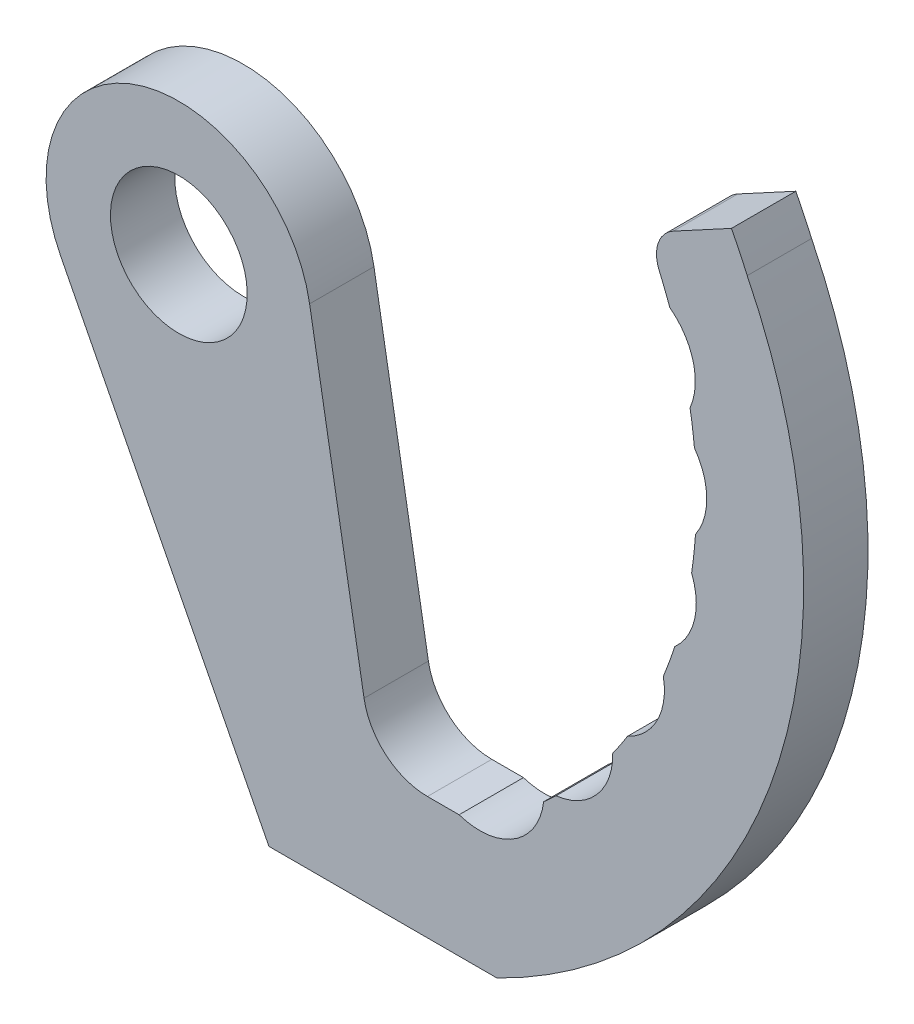
ISO-10303-21;
HEADER;
FILE_DESCRIPTION(('STEP AP214'),'2;1');
FILE_NAME('part.step','',(''),(''),'','','');
FILE_SCHEMA(('AUTOMOTIVE_DESIGN { 1 0 10303 214 1 1 1 1 }'));
ENDSEC;
DATA;
#1=APPLICATION_CONTEXT('core data for automotive mechanical design processes');
#2=APPLICATION_PROTOCOL_DEFINITION('international standard','automotive_design',2000,#1);
#3=PRODUCT_CONTEXT('',#1,'mechanical');
#4=PRODUCT('Part','Part','',(#3));
#5=PRODUCT_RELATED_PRODUCT_CATEGORY('part','',(#4));
#6=PRODUCT_DEFINITION_FORMATION('','',#4);
#7=PRODUCT_DEFINITION_CONTEXT('part definition',#1,'design');
#8=PRODUCT_DEFINITION('design','',#6,#7);
#9=PRODUCT_DEFINITION_SHAPE('','',#8);
#10=(LENGTH_UNIT() NAMED_UNIT(*) SI_UNIT(.MILLI.,.METRE.));
#11=(NAMED_UNIT(*) PLANE_ANGLE_UNIT() SI_UNIT($,.RADIAN.));
#12=(NAMED_UNIT(*) SI_UNIT($,.STERADIAN.) SOLID_ANGLE_UNIT());
#13=UNCERTAINTY_MEASURE_WITH_UNIT(LENGTH_MEASURE(1.E-05),#10,'distance_accuracy_value','');
#14=(GEOMETRIC_REPRESENTATION_CONTEXT(3) GLOBAL_UNCERTAINTY_ASSIGNED_CONTEXT((#13)) GLOBAL_UNIT_ASSIGNED_CONTEXT((#10,
#11,#12)) REPRESENTATION_CONTEXT('',''));
#15=CARTESIAN_POINT('',(0.,0.,0.));
#16=DIRECTION('',(0.,0.,1.));
#17=DIRECTION('',(1.,0.,0.));
#18=AXIS2_PLACEMENT_3D('',#15,#16,#17);
#19=CARTESIAN_POINT('',(24.7140074252524,-7.04904251244394,-32.9445393936819));
#20=DIRECTION('',(0.,0.,1.));
#21=DIRECTION('',(1.,0.,0.));
#22=AXIS2_PLACEMENT_3D('',#19,#20,#21);
#23=CYLINDRICAL_SURFACE('',#22,14.);
#24=CARTESIAN_POINT('',(24.7140074252524,-7.04904251244394,2.));
#25=DIRECTION('',(0.,0.,-1.));
#26=DIRECTION('',(1.,0.,0.));
#27=AXIS2_PLACEMENT_3D('',#24,#25,#26);
#28=CIRCLE('',#27,14.);
#29=CARTESIAN_POINT('',(37.5525925149801,-1.46596693586251,2.));
#30=VERTEX_POINT('',#29);
#31=CARTESIAN_POINT('',(37.8837844841976,-2.29962441991074,2.));
#32=VERTEX_POINT('',#31);
#33=EDGE_CURVE('E259',#30,#32,#28,.T.);
#34=ORIENTED_EDGE('',*,*,#33,.F.);
#35=DIRECTION('',(0.,0.,1.));
#36=VECTOR('',#35,1.);
#37=CARTESIAN_POINT('',(37.5525925149801,-1.46596693586251,-32.9445393936819));
#38=LINE('',#37,#36);
#39=CARTESIAN_POINT('',(37.5525925149801,-1.46596693586251,0.));
#40=VERTEX_POINT('',#39);
#41=EDGE_CURVE('E320',#30,#40,#38,.F.);
#42=ORIENTED_EDGE('',*,*,#41,.T.);
#43=CARTESIAN_POINT('',(24.7140074252524,-7.04904251244394,0.));
#44=DIRECTION('',(0.,0.,1.));
#45=DIRECTION('',(1.,0.,0.));
#46=AXIS2_PLACEMENT_3D('',#43,#44,#45);
#47=CIRCLE('',#46,14.);
#48=CARTESIAN_POINT('',(37.8837844841976,-2.29962441991074,0.));
#49=VERTEX_POINT('',#48);
#50=EDGE_CURVE('E254',#49,#40,#47,.T.);
#51=ORIENTED_EDGE('',*,*,#50,.F.);
#52=DIRECTION('',(0.,0.,1.));
#53=VECTOR('',#52,1.);
#54=CARTESIAN_POINT('',(37.8837844841976,-2.29962441991074,1.));
#55=LINE('',#54,#53);
#56=EDGE_CURVE('E313',#32,#49,#55,.F.);
#57=ORIENTED_EDGE('',*,*,#56,.F.);
#58=EDGE_LOOP('',(#34,#42,#51,#57));
#59=FACE_BOUND('',#58,.T.);
#60=ADVANCED_FACE('F33',(#59),#23,.F.);
#61=DIRECTION('',(0.,0.,1.));
#62=VECTOR('',#61,1.);
#63=CARTESIAN_POINT('',(38.5129052556318,-4.68463589201005,1.));
#64=LINE('',#63,#62);
#65=CARTESIAN_POINT('',(38.5129052556318,-4.68463589201005,0.));
#66=VERTEX_POINT('',#65);
#67=CARTESIAN_POINT('',(38.5129052556318,-4.68463589201005,2.));
#68=VERTEX_POINT('',#67);
#69=EDGE_CURVE('E311',#66,#68,#64,.T.);
#70=ORIENTED_EDGE('',*,*,#69,.F.);
#71=CARTESIAN_POINT('',(38.6483797643493,-5.69506041676816,0.));
#72=VERTEX_POINT('',#71);
#73=EDGE_CURVE('E257',#72,#66,#47,.T.);
#74=ORIENTED_EDGE('',*,*,#73,.F.);
#75=DIRECTION('',(0.,0.,1.));
#76=VECTOR('',#75,1.);
#77=CARTESIAN_POINT('',(38.6483797643493,-5.69506041676816,1.));
#78=LINE('',#77,#76);
#79=CARTESIAN_POINT('',(38.6483797643493,-5.69506041676816,2.));
#80=VERTEX_POINT('',#79);
#81=EDGE_CURVE('E309',#80,#72,#78,.F.);
#82=ORIENTED_EDGE('',*,*,#81,.F.);
#83=EDGE_CURVE('E262',#68,#80,#28,.T.);
#84=ORIENTED_EDGE('',*,*,#83,.F.);
#85=EDGE_LOOP('',(#70,#74,#82,#84));
#86=FACE_BOUND('',#85,.T.);
#87=ADVANCED_FACE('F366',(#86),#23,.F.);
#88=DIRECTION('',(0.,0.,1.));
#89=VECTOR('',#88,1.);
#90=CARTESIAN_POINT('',(38.6814538618581,-8.00321232990399,1.));
#91=LINE('',#90,#89);
#92=CARTESIAN_POINT('',(38.6814538618581,-8.00321232990399,0.));
#93=VERTEX_POINT('',#92);
#94=CARTESIAN_POINT('',(38.6814538618581,-8.00321232990399,2.));
#95=VERTEX_POINT('',#94);
#96=EDGE_CURVE('E307',#93,#95,#91,.T.);
#97=ORIENTED_EDGE('',*,*,#96,.F.);
#98=CARTESIAN_POINT('',(38.5616403743681,-9.10891185455434,0.));
#99=VERTEX_POINT('',#98);
#100=EDGE_CURVE('E354',#99,#93,#47,.T.);
#101=ORIENTED_EDGE('',*,*,#100,.F.);
#102=DIRECTION('',(0.,0.,1.));
#103=VECTOR('',#102,1.);
#104=CARTESIAN_POINT('',(38.5616403743681,-9.10891185455435,1.));
#105=LINE('',#104,#103);
#106=CARTESIAN_POINT('',(38.5616403743681,-9.10891185455434,2.));
#107=VERTEX_POINT('',#106);
#108=EDGE_CURVE('E305',#107,#99,#105,.F.);
#109=ORIENTED_EDGE('',*,*,#108,.F.);
#110=EDGE_CURVE('E442',#95,#107,#28,.T.);
#111=ORIENTED_EDGE('',*,*,#110,.F.);
#112=EDGE_LOOP('',(#97,#101,#109,#111));
#113=FACE_BOUND('',#112,.T.);
#114=ADVANCED_FACE('F407',(#113),#23,.F.);
#115=DIRECTION('',(0.,0.,1.));
#116=VECTOR('',#115,1.);
#117=CARTESIAN_POINT('',(38.0381005291906,-11.3465467832487,1.));
#118=LINE('',#117,#116);
#119=CARTESIAN_POINT('',(38.0381005291906,-11.3465467832488,0.));
#120=VERTEX_POINT('',#119);
#121=CARTESIAN_POINT('',(38.0381005291906,-11.3465467832488,2.));
#122=VERTEX_POINT('',#121);
#123=EDGE_CURVE('E303',#120,#122,#118,.T.);
#124=ORIENTED_EDGE('',*,*,#123,.F.);
#125=CARTESIAN_POINT('',(37.6822220453035,-12.3240220923374,0.));
#126=VERTEX_POINT('',#125);
#127=EDGE_CURVE('E351',#126,#120,#47,.T.);
#128=ORIENTED_EDGE('',*,*,#127,.F.);
#129=DIRECTION('',(0.,0.,1.));
#130=VECTOR('',#129,1.);
#131=CARTESIAN_POINT('',(37.6822220453035,-12.3240220923374,1.));
#132=LINE('',#131,#130);
#133=CARTESIAN_POINT('',(37.6822220453035,-12.3240220923374,2.));
#134=VERTEX_POINT('',#133);
#135=EDGE_CURVE('E301',#134,#126,#132,.F.);
#136=ORIENTED_EDGE('',*,*,#135,.F.);
#137=EDGE_CURVE('E439',#122,#134,#28,.T.);
#138=ORIENTED_EDGE('',*,*,#137,.F.);
#139=EDGE_LOOP('',(#124,#128,#136,#138));
#140=FACE_BOUND('',#139,.T.);
#141=ADVANCED_FACE('F419',(#140),#23,.F.);
#142=DIRECTION('',(0.,0.,1.));
#143=VECTOR('',#142,1.);
#144=CARTESIAN_POINT('',(36.5698297949346,-14.4948115082256,1.));
#145=LINE('',#144,#143);
#146=CARTESIAN_POINT('',(36.5698297949346,-14.4948115082256,0.));
#147=VERTEX_POINT('',#146);
#148=CARTESIAN_POINT('',(36.5698297949346,-14.4948115082256,2.));
#149=VERTEX_POINT('',#148);
#150=EDGE_CURVE('E299',#147,#149,#145,.T.);
#151=ORIENTED_EDGE('',*,*,#150,.F.);
#152=CARTESIAN_POINT('',(36.1106980187306,-15.1801828701382,0.));
#153=VERTEX_POINT('',#152);
#154=EDGE_CURVE('E349',#153,#147,#47,.T.);
#155=ORIENTED_EDGE('',*,*,#154,.F.);
#156=DIRECTION('',(0.,0.,1.));
#157=VECTOR('',#156,1.);
#158=CARTESIAN_POINT('',(36.1106980187306,-15.1801828701382,1.));
#159=LINE('',#158,#157);
#160=CARTESIAN_POINT('',(36.1106980187306,-15.1801828701382,2.));
#161=VERTEX_POINT('',#160);
#162=EDGE_CURVE('E297',#161,#153,#159,.F.);
#163=ORIENTED_EDGE('',*,*,#162,.F.);
#164=EDGE_CURVE('E431',#149,#161,#28,.T.);
#165=ORIENTED_EDGE('',*,*,#164,.F.);
#166=EDGE_LOOP('',(#151,#155,#163,#165));
#167=FACE_BOUND('',#166,.T.);
#168=ADVANCED_FACE('F411',(#167),#23,.F.);
#169=CARTESIAN_POINT('',(22.6259645427585,-8.50000000000001,13.667261889578));
#170=DIRECTION('',(0.,0.,-1.));
#171=DIRECTION('',(-1.,0.,0.));
#172=AXIS2_PLACEMENT_3D('',#169,#170,#171);
#173=CYLINDRICAL_SURFACE('',#172,4.125);
#174=DIRECTION('',(0.,0.,1.));
#175=VECTOR('',#174,1.);
#176=CARTESIAN_POINT('',(18.9536577577615,-10.3787729710811,-32.9445393936819));
#177=LINE('',#176,#175);
#178=CARTESIAN_POINT('',(18.9536577577615,-10.3787729710811,0.));
#179=VERTEX_POINT('',#178);
#180=CARTESIAN_POINT('',(18.9536577577615,-10.3787729710811,2.));
#181=VERTEX_POINT('',#180);
#182=EDGE_CURVE('E275',#179,#181,#177,.T.);
#183=ORIENTED_EDGE('',*,*,#182,.T.);
#184=CARTESIAN_POINT('',(22.6259645427585,-8.50000000000001,2.));
#185=DIRECTION('',(0.,0.,1.));
#186=DIRECTION('',(0.,-1.,0.));
#187=AXIS2_PLACEMENT_3D('',#184,#185,#186);
#188=CIRCLE('',#187,4.125);
#189=CARTESIAN_POINT('',(26.690529557794,-7.79648295077549,2.));
#190=VERTEX_POINT('',#189);
#191=EDGE_CURVE('E283',#190,#181,#188,.T.);
#192=ORIENTED_EDGE('',*,*,#191,.F.);
#193=DIRECTION('',(0.,0.,1.));
#194=VECTOR('',#193,1.);
#195=CARTESIAN_POINT('',(26.690529557794,-7.79648295077548,-32.9445393936819));
#196=LINE('',#195,#194);
#197=CARTESIAN_POINT('',(26.690529557794,-7.79648295077548,0.));
#198=VERTEX_POINT('',#197);
#199=EDGE_CURVE('E270',#198,#190,#196,.T.);
#200=ORIENTED_EDGE('',*,*,#199,.F.);
#201=CARTESIAN_POINT('',(22.6259645427585,-8.50000000000001,0.));
#202=DIRECTION('',(0.,0.,1.));
#203=DIRECTION('',(1.,0.,0.));
#204=AXIS2_PLACEMENT_3D('',#201,#202,#203);
#205=CIRCLE('',#204,4.125);
#206=EDGE_CURVE('E286',#198,#179,#205,.T.);
#207=ORIENTED_EDGE('',*,*,#206,.T.);
#208=EDGE_LOOP('',(#183,#192,#200,#207));
#209=FACE_BOUND('',#208,.T.);
#210=ADVANCED_FACE('F397',(#209),#173,.T.);
#211=CARTESIAN_POINT('',(22.6259645427585,-8.50000000000001,0.));
#212=DIRECTION('',(0.,0.,1.));
#213=DIRECTION('',(1.,0.,0.));
#214=AXIS2_PLACEMENT_3D('',#211,#212,#213);
#215=PLANE('',#214);
#216=ORIENTED_EDGE('',*,*,#50,.T.);
#217=CARTESIAN_POINT('',(38.4696343071036,-1.06717582324955,0.));
#218=DIRECTION('',(0.,0.,1.));
#219=DIRECTION('',(1.,0.,0.));
#220=AXIS2_PLACEMENT_3D('',#217,#218,#219);
#221=CIRCLE('',#220,1.);
#222=CARTESIAN_POINT('',(37.9938771756154,-0.187599134246167,0.));
#223=VERTEX_POINT('',#222);
#224=EDGE_CURVE('E322',#40,#223,#221,.F.);
#225=ORIENTED_EDGE('',*,*,#224,.T.);
#226=DIRECTION('',(0.879576689003386,0.475757131488159,0.));
#227=VECTOR('',#226,1.);
#228=CARTESIAN_POINT('',(37.1601250215349,-0.638570082153941,0.));
#229=LINE('',#228,#227);
#230=CARTESIAN_POINT('',(39.798855088545,0.788701312310537,0.));
#231=VERTEX_POINT('',#230);
#232=EDGE_CURVE('E252',#223,#231,#229,.T.);
#233=ORIENTED_EDGE('',*,*,#232,.T.);
#234=CARTESIAN_POINT('',(24.7140074252524,-7.04904251244394,0.));
#235=DIRECTION('',(0.,0.,1.));
#236=DIRECTION('',(1.,0.,0.));
#237=AXIS2_PLACEMENT_3D('',#234,#235,#236);
#238=CIRCLE('',#237,16.9994957950882);
#239=CARTESIAN_POINT('',(40.289284919479,-0.237758619883036,0.));
#240=VERTEX_POINT('',#239);
#241=EDGE_CURVE('E249',#231,#240,#238,.F.);
#242=ORIENTED_EDGE('',*,*,#241,.T.);
#243=CARTESIAN_POINT('',(25.0435996578706,-7.75786089253855,0.));
#244=DIRECTION('',(0.,0.,1.));
#245=DIRECTION('',(1.,0.,0.));
#246=AXIS2_PLACEMENT_3D('',#243,#244,#245);
#247=CIRCLE('',#246,16.9994957950882);
#248=CARTESIAN_POINT('',(32.5097641664944,-23.0300331289098,0.));
#249=VERTEX_POINT('',#248);
#250=EDGE_CURVE('E207',#240,#249,#247,.F.);
#251=ORIENTED_EDGE('',*,*,#250,.T.);
#252=DIRECTION('',(-1.,0.,0.));
#253=VECTOR('',#252,1.);
#254=CARTESIAN_POINT('',(30.5097641664944,-23.0300331289098,0.));
#255=LINE('',#254,#253);
#256=CARTESIAN_POINT('',(25.4261141799071,-23.0300331289098,0.));
#257=VERTEX_POINT('',#256);
#258=EDGE_CURVE('E197',#249,#257,#255,.T.);
#259=ORIENTED_EDGE('',*,*,#258,.T.);
#260=DIRECTION('',(-0.455460114201465,0.890256190302313,0.));
#261=VECTOR('',#260,1.);
#262=CARTESIAN_POINT('',(25.4261141799071,-23.0300331289098,0.));
#263=LINE('',#262,#261);
#264=EDGE_CURVE('E245',#257,#179,#263,.T.);
#265=ORIENTED_EDGE('',*,*,#264,.T.);
#266=ORIENTED_EDGE('',*,*,#206,.F.);
#267=DIRECTION('',(0.170549587690792,-0.985349094554058,0.));
#268=VECTOR('',#267,1.);
#269=CARTESIAN_POINT('',(28.6684327445412,-19.2238052947636,0.));
#270=LINE('',#269,#268);
#271=CARTESIAN_POINT('',(28.3813011551154,-17.5649044701452,0.));
#272=VERTEX_POINT('',#271);
#273=EDGE_CURVE('E243',#198,#272,#270,.T.);
#274=ORIENTED_EDGE('',*,*,#273,.T.);
#275=CARTESIAN_POINT('',(30.3519993442235,-17.2238052947636,0.));
#276=DIRECTION('',(0.,0.,1.));
#277=DIRECTION('',(1.,0.,0.));
#278=AXIS2_PLACEMENT_3D('',#275,#276,#277);
#279=CIRCLE('',#278,2.);
#280=CARTESIAN_POINT('',(30.3519993442235,-19.2238052947636,0.));
#281=VERTEX_POINT('',#280);
#282=EDGE_CURVE('E11',#272,#281,#279,.T.);
#283=ORIENTED_EDGE('',*,*,#282,.T.);
#284=DIRECTION('',(1.,0.,0.));
#285=VECTOR('',#284,1.);
#286=CARTESIAN_POINT('',(31.6259645427585,-19.2238052947636,0.));
#287=LINE('',#286,#285);
#288=CARTESIAN_POINT('',(31.3357533913953,-19.2238052947636,0.));
#289=VERTEX_POINT('',#288);
#290=EDGE_CURVE('E280',#281,#289,#287,.T.);
#291=ORIENTED_EDGE('',*,*,#290,.T.);
#292=CARTESIAN_POINT('',(31.9760703135329,-17.3290772828251,0.));
#293=DIRECTION('',(0.,0.,1.));
#294=DIRECTION('',(1.,0.,0.));
#295=AXIS2_PLACEMENT_3D('',#292,#293,#294);
#296=CIRCLE('',#295,2.);
#297=CARTESIAN_POINT('',(33.9628075444752,-17.5590233095084,0.));
#298=VERTEX_POINT('',#297);
#299=EDGE_CURVE('E209',#289,#298,#296,.T.);
#300=ORIENTED_EDGE('',*,*,#299,.T.);
#301=CARTESIAN_POINT('',(34.3475141918604,-17.2075634371513,0.));
#302=VERTEX_POINT('',#301);
#303=EDGE_CURVE('E258',#298,#302,#47,.T.);
#304=ORIENTED_EDGE('',*,*,#303,.T.);
#305=CARTESIAN_POINT('',(34.1111265438652,-15.2215823496595,0.));
#306=DIRECTION('',(0.,0.,1.));
#307=DIRECTION('',(1.,0.,0.));
#308=AXIS2_PLACEMENT_3D('',#305,#306,#307);
#309=CIRCLE('',#308,2.00000000000001);
#310=EDGE_CURVE('E212',#302,#153,#309,.T.);
#311=ORIENTED_EDGE('',*,*,#310,.T.);
#312=ORIENTED_EDGE('',*,*,#154,.T.);
#313=CARTESIAN_POINT('',(35.7153502760962,-12.6865347727988,0.));
#314=DIRECTION('',(0.,0.,1.));
#315=DIRECTION('',(1.,0.,0.));
#316=AXIS2_PLACEMENT_3D('',#313,#314,#315);
#317=CIRCLE('',#316,1.99999999999999);
#318=EDGE_CURVE('E216',#147,#126,#317,.T.);
#319=ORIENTED_EDGE('',*,*,#318,.T.);
#320=ORIENTED_EDGE('',*,*,#127,.T.);
#321=CARTESIAN_POINT('',(36.7059306961373,-9.85479494869225,0.));
#322=DIRECTION('',(0.,0.,1.));
#323=DIRECTION('',(1.,0.,0.));
#324=AXIS2_PLACEMENT_3D('',#321,#322,#323);
#325=CIRCLE('',#324,2.);
#326=EDGE_CURVE('E219',#120,#99,#325,.T.);
#327=ORIENTED_EDGE('',*,*,#326,.T.);
#328=ORIENTED_EDGE('',*,*,#100,.T.);
#329=CARTESIAN_POINT('',(37.0317335579632,-6.87253867277865,0.));
#330=DIRECTION('',(0.,0.,1.));
#331=DIRECTION('',(1.,0.,0.));
#332=AXIS2_PLACEMENT_3D('',#329,#330,#331);
#333=CIRCLE('',#332,2.00000000000001);
#334=EDGE_CURVE('E222',#93,#72,#333,.T.);
#335=ORIENTED_EDGE('',*,*,#334,.T.);
#336=ORIENTED_EDGE('',*,*,#73,.T.);
#337=CARTESIAN_POINT('',(36.6759407584141,-3.89371147339481,0.));
#338=DIRECTION('',(0.,0.,1.));
#339=DIRECTION('',(1.,0.,0.));
#340=AXIS2_PLACEMENT_3D('',#337,#338,#339);
#341=CIRCLE('',#340,2.);
#342=EDGE_CURVE('E225',#66,#49,#341,.T.);
#343=ORIENTED_EDGE('',*,*,#342,.T.);
#344=EDGE_LOOP('',(#216,#225,#233,#242,#251,#259,#265,#266,#274,#283,#291,#300,#304,#311,#312,
#319,#320,#327,#328,#335,#336,#343));
#345=FACE_BOUND('',#344,.T.);
#346=CARTESIAN_POINT('',(22.6259645427585,-8.50000000000001,0.));
#347=DIRECTION('',(0.,0.,1.));
#348=DIRECTION('',(1.,0.,0.));
#349=AXIS2_PLACEMENT_3D('',#346,#347,#348);
#350=CIRCLE('',#349,2.125);
#351=CARTESIAN_POINT('',(24.7509645427585,-8.50000000000001,0.));
#352=VERTEX_POINT('',#351);
#353=EDGE_CURVE('E287',#352,#352,#350,.T.);
#354=ORIENTED_EDGE('',*,*,#353,.T.);
#355=EDGE_LOOP('',(#354));
#356=FACE_BOUND('',#355,.T.);
#357=ADVANCED_FACE('F360',(#345,#356),#215,.F.);
#358=CARTESIAN_POINT('',(22.6259645427585,-8.50000000000001,13.667261889578));
#359=DIRECTION('',(0.,0.,-1.));
#360=DIRECTION('',(-1.,0.,0.));
#361=AXIS2_PLACEMENT_3D('',#358,#359,#360);
#362=CYLINDRICAL_SURFACE('',#361,2.125);
#363=ORIENTED_EDGE('',*,*,#353,.F.);
#364=EDGE_LOOP('',(#363));
#365=FACE_BOUND('',#364,.T.);
#366=CARTESIAN_POINT('',(22.6259645427585,-8.50000000000001,2.));
#367=DIRECTION('',(0.,0.,1.));
#368=DIRECTION('',(0.,-1.,0.));
#369=AXIS2_PLACEMENT_3D('',#366,#367,#368);
#370=CIRCLE('',#369,2.125);
#371=CARTESIAN_POINT('',(22.6259645427585,-10.625,2.));
#372=VERTEX_POINT('',#371);
#373=EDGE_CURVE('E282',#372,#372,#370,.T.);
#374=ORIENTED_EDGE('',*,*,#373,.T.);
#375=EDGE_LOOP('',(#374));
#376=FACE_BOUND('',#375,.T.);
#377=ADVANCED_FACE('F417',(#365,#376),#362,.F.);
#378=CARTESIAN_POINT('',(36.6259645427585,-8.5,2.));
#379=DIRECTION('',(0.,0.,1.));
#380=DIRECTION('',(0.,-1.,0.));
#381=AXIS2_PLACEMENT_3D('',#378,#379,#380);
#382=PLANE('',#381);
#383=DIRECTION('',(-0.879576689003386,-0.475757131488159,0.));
#384=VECTOR('',#383,1.);
#385=CARTESIAN_POINT('',(37.1601250215349,-0.638570082153941,2.));
#386=LINE('',#385,#384);
#387=CARTESIAN_POINT('',(39.798855088545,0.788701312310537,2.));
#388=VERTEX_POINT('',#387);
#389=CARTESIAN_POINT('',(37.9938771756154,-0.187599134246167,2.));
#390=VERTEX_POINT('',#389);
#391=EDGE_CURVE('E268',#388,#390,#386,.T.);
#392=ORIENTED_EDGE('',*,*,#391,.T.);
#393=CARTESIAN_POINT('',(38.4696343071036,-1.06717582324955,2.));
#394=DIRECTION('',(0.,0.,1.));
#395=DIRECTION('',(0.,-1.,0.));
#396=AXIS2_PLACEMENT_3D('',#393,#394,#395);
#397=CIRCLE('',#396,1.);
#398=EDGE_CURVE('E318',#390,#30,#397,.T.);
#399=ORIENTED_EDGE('',*,*,#398,.T.);
#400=ORIENTED_EDGE('',*,*,#33,.T.);
#401=CARTESIAN_POINT('',(36.6759407584141,-3.89371147339481,2.));
#402=DIRECTION('',(0.,0.,1.));
#403=DIRECTION('',(1.,0.,0.));
#404=AXIS2_PLACEMENT_3D('',#401,#402,#403);
#405=CIRCLE('',#404,2.);
#406=EDGE_CURVE('E213',#68,#32,#405,.T.);
#407=ORIENTED_EDGE('',*,*,#406,.F.);
#408=ORIENTED_EDGE('',*,*,#83,.T.);
#409=CARTESIAN_POINT('',(37.0317335579632,-6.87253867277865,2.));
#410=DIRECTION('',(0.,0.,1.));
#411=DIRECTION('',(1.,0.,0.));
#412=AXIS2_PLACEMENT_3D('',#409,#410,#411);
#413=CIRCLE('',#412,2.00000000000001);
#414=EDGE_CURVE('E237',#95,#80,#413,.T.);
#415=ORIENTED_EDGE('',*,*,#414,.F.);
#416=ORIENTED_EDGE('',*,*,#110,.T.);
#417=CARTESIAN_POINT('',(36.7059306961373,-9.85479494869225,2.));
#418=DIRECTION('',(0.,0.,1.));
#419=DIRECTION('',(1.,0.,0.));
#420=AXIS2_PLACEMENT_3D('',#417,#418,#419);
#421=CIRCLE('',#420,2.);
#422=EDGE_CURVE('E235',#122,#107,#421,.T.);
#423=ORIENTED_EDGE('',*,*,#422,.F.);
#424=ORIENTED_EDGE('',*,*,#137,.T.);
#425=CARTESIAN_POINT('',(35.7153502760962,-12.6865347727988,2.));
#426=DIRECTION('',(0.,0.,1.));
#427=DIRECTION('',(1.,0.,0.));
#428=AXIS2_PLACEMENT_3D('',#425,#426,#427);
#429=CIRCLE('',#428,1.99999999999999);
#430=EDGE_CURVE('E233',#149,#134,#429,.T.);
#431=ORIENTED_EDGE('',*,*,#430,.F.);
#432=ORIENTED_EDGE('',*,*,#164,.T.);
#433=CARTESIAN_POINT('',(34.1111265438652,-15.2215823496595,2.));
#434=DIRECTION('',(0.,0.,1.));
#435=DIRECTION('',(1.,0.,0.));
#436=AXIS2_PLACEMENT_3D('',#433,#434,#435);
#437=CIRCLE('',#436,2.00000000000001);
#438=CARTESIAN_POINT('',(34.3475141918604,-17.2075634371513,2.));
#439=VERTEX_POINT('',#438);
#440=EDGE_CURVE('E231',#439,#161,#437,.T.);
#441=ORIENTED_EDGE('',*,*,#440,.F.);
#442=CARTESIAN_POINT('',(33.9628075444752,-17.5590233095084,2.));
#443=VERTEX_POINT('',#442);
#444=EDGE_CURVE('E242',#439,#443,#28,.T.);
#445=ORIENTED_EDGE('',*,*,#444,.T.);
#446=CARTESIAN_POINT('',(31.9760703135329,-17.3290772828251,2.));
#447=DIRECTION('',(0.,0.,1.));
#448=DIRECTION('',(1.,0.,0.));
#449=AXIS2_PLACEMENT_3D('',#446,#447,#448);
#450=CIRCLE('',#449,2.);
#451=CARTESIAN_POINT('',(31.3357533913953,-19.2238052947636,2.));
#452=VERTEX_POINT('',#451);
#453=EDGE_CURVE('E229',#452,#443,#450,.T.);
#454=ORIENTED_EDGE('',*,*,#453,.F.);
#455=DIRECTION('',(-1.,0.,0.));
#456=VECTOR('',#455,1.);
#457=CARTESIAN_POINT('',(31.6259645427585,-19.2238052947636,2.));
#458=LINE('',#457,#456);
#459=CARTESIAN_POINT('',(30.3519993442235,-19.2238052947636,2.));
#460=VERTEX_POINT('',#459);
#461=EDGE_CURVE('E261',#452,#460,#458,.T.);
#462=ORIENTED_EDGE('',*,*,#461,.T.);
#463=CARTESIAN_POINT('',(30.3519993442235,-17.2238052947636,2.));
#464=DIRECTION('',(0.,0.,1.));
#465=DIRECTION('',(0.,-1.,0.));
#466=AXIS2_PLACEMENT_3D('',#463,#464,#465);
#467=CIRCLE('',#466,2.);
#468=CARTESIAN_POINT('',(28.3813011551154,-17.5649044701452,2.));
#469=VERTEX_POINT('',#468);
#470=EDGE_CURVE('E41',#460,#469,#467,.F.);
#471=ORIENTED_EDGE('',*,*,#470,.T.);
#472=DIRECTION('',(-0.170549587690792,0.985349094554057,0.));
#473=VECTOR('',#472,1.);
#474=CARTESIAN_POINT('',(28.6684327445412,-19.2238052947636,2.));
#475=LINE('',#474,#473);
#476=EDGE_CURVE('E264',#469,#190,#475,.T.);
#477=ORIENTED_EDGE('',*,*,#476,.T.);
#478=ORIENTED_EDGE('',*,*,#191,.T.);
#479=DIRECTION('',(0.455460114201465,-0.890256190302313,0.));
#480=VECTOR('',#479,1.);
#481=CARTESIAN_POINT('',(25.4261141799071,-23.0300331289098,2.));
#482=LINE('',#481,#480);
#483=CARTESIAN_POINT('',(25.4261141799071,-23.0300331289098,2.));
#484=VERTEX_POINT('',#483);
#485=EDGE_CURVE('E189',#181,#484,#482,.T.);
#486=ORIENTED_EDGE('',*,*,#485,.T.);
#487=DIRECTION('',(1.,0.,0.));
#488=VECTOR('',#487,1.);
#489=CARTESIAN_POINT('',(30.5097641664944,-23.0300331289098,2.));
#490=LINE('',#489,#488);
#491=CARTESIAN_POINT('',(32.5097641664944,-23.0300331289098,2.));
#492=VERTEX_POINT('',#491);
#493=EDGE_CURVE('E180',#484,#492,#490,.T.);
#494=ORIENTED_EDGE('',*,*,#493,.T.);
#495=CARTESIAN_POINT('',(25.0435996578706,-7.75786089253855,2.));
#496=DIRECTION('',(0.,0.,1.));
#497=DIRECTION('',(1.,0.,0.));
#498=AXIS2_PLACEMENT_3D('',#495,#496,#497);
#499=CIRCLE('',#498,16.9994957950882);
#500=CARTESIAN_POINT('',(40.289284919479,-0.237758619883038,2.));
#501=VERTEX_POINT('',#500);
#502=EDGE_CURVE('E186',#492,#501,#499,.T.);
#503=ORIENTED_EDGE('',*,*,#502,.T.);
#504=CARTESIAN_POINT('',(24.7140074252524,-7.04904251244394,2.));
#505=DIRECTION('',(0.,0.,1.));
#506=DIRECTION('',(-1.,0.,0.));
#507=AXIS2_PLACEMENT_3D('',#504,#505,#506);
#508=CIRCLE('',#507,16.9994957950882);
#509=EDGE_CURVE('E192',#501,#388,#508,.T.);
#510=ORIENTED_EDGE('',*,*,#509,.T.);
#511=EDGE_LOOP('',(#392,#399,#400,#407,#408,#415,#416,#423,#424,#431,#432,#441,#445,#454,#462,
#471,#477,#478,#486,#494,#503,#510));
#512=FACE_BOUND('',#511,.T.);
#513=ORIENTED_EDGE('',*,*,#373,.F.);
#514=EDGE_LOOP('',(#513));
#515=FACE_BOUND('',#514,.T.);
#516=ADVANCED_FACE('F183',(#512,#515),#382,.T.);
#517=DIRECTION('',(0.,0.,1.));
#518=VECTOR('',#517,1.);
#519=CARTESIAN_POINT('',(34.3475141918604,-17.2075634371513,1.));
#520=LINE('',#519,#518);
#521=EDGE_CURVE('E295',#302,#439,#520,.T.);
#522=ORIENTED_EDGE('',*,*,#521,.F.);
#523=ORIENTED_EDGE('',*,*,#303,.F.);
#524=DIRECTION('',(0.,0.,1.));
#525=VECTOR('',#524,1.);
#526=CARTESIAN_POINT('',(33.9628075444752,-17.5590233095084,1.));
#527=LINE('',#526,#525);
#528=EDGE_CURVE('E228',#443,#298,#527,.F.);
#529=ORIENTED_EDGE('',*,*,#528,.F.);
#530=ORIENTED_EDGE('',*,*,#444,.F.);
#531=EDGE_LOOP('',(#522,#523,#529,#530));
#532=FACE_BOUND('',#531,.T.);
#533=ADVANCED_FACE('F346',(#532),#23,.F.);
#534=CARTESIAN_POINT('',(37.1601250215349,-0.638570082153941,-32.9445393936819));
#535=DIRECTION('',(-0.475757131488159,0.879576689003386,0.));
#536=DIRECTION('',(-0.879576689003386,-0.475757131488159,0.));
#537=AXIS2_PLACEMENT_3D('',#534,#535,#536);
#538=PLANE('',#537);
#539=ORIENTED_EDGE('',*,*,#232,.F.);
#540=DIRECTION('',(0.,0.,1.));
#541=VECTOR('',#540,1.);
#542=CARTESIAN_POINT('',(37.9938771756154,-0.187599134246167,-32.9445393936819));
#543=LINE('',#542,#541);
#544=EDGE_CURVE('E315',#223,#390,#543,.T.);
#545=ORIENTED_EDGE('',*,*,#544,.T.);
#546=ORIENTED_EDGE('',*,*,#391,.F.);
#547=DIRECTION('',(0.,0.,1.));
#548=VECTOR('',#547,1.);
#549=CARTESIAN_POINT('',(39.798855088545,0.788701312310537,-32.9445393936819));
#550=LINE('',#549,#548);
#551=EDGE_CURVE('E246',#231,#388,#550,.T.);
#552=ORIENTED_EDGE('',*,*,#551,.F.);
#553=EDGE_LOOP('',(#539,#545,#546,#552));
#554=FACE_BOUND('',#553,.T.);
#555=ADVANCED_FACE('F385',(#554),#538,.T.);
#556=CARTESIAN_POINT('',(24.7140074252524,-7.04904251244394,-32.9445393936819));
#557=DIRECTION('',(0.,0.,1.));
#558=DIRECTION('',(1.,0.,0.));
#559=AXIS2_PLACEMENT_3D('',#556,#557,#558);
#560=CYLINDRICAL_SURFACE('',#559,16.9994957950882);
#561=DIRECTION('',(0.,0.,1.));
#562=VECTOR('',#561,1.);
#563=CARTESIAN_POINT('',(40.289284919479,-0.237758619883038,-25.5441873595182));
#564=LINE('',#563,#562);
#565=EDGE_CURVE('E200',#240,#501,#564,.T.);
#566=ORIENTED_EDGE('',*,*,#565,.F.);
#567=ORIENTED_EDGE('',*,*,#241,.F.);
#568=ORIENTED_EDGE('',*,*,#551,.T.);
#569=ORIENTED_EDGE('',*,*,#509,.F.);
#570=EDGE_LOOP('',(#566,#567,#568,#569));
#571=FACE_BOUND('',#570,.T.);
#572=ADVANCED_FACE('F388',(#571),#560,.T.);
#573=CARTESIAN_POINT('',(30.5097641664944,-23.0300331289098,-32.9445393936819));
#574=DIRECTION('',(0.,-1.,0.));
#575=DIRECTION('',(1.,0.,0.));
#576=AXIS2_PLACEMENT_3D('',#573,#574,#575);
#577=PLANE('',#576);
#578=ORIENTED_EDGE('',*,*,#258,.F.);
#579=DIRECTION('',(0.,0.,1.));
#580=VECTOR('',#579,1.);
#581=CARTESIAN_POINT('',(32.5097641664944,-23.0300331289098,-25.5441873595182));
#582=LINE('',#581,#580);
#583=EDGE_CURVE('E195',#249,#492,#582,.T.);
#584=ORIENTED_EDGE('',*,*,#583,.T.);
#585=ORIENTED_EDGE('',*,*,#493,.F.);
#586=DIRECTION('',(0.,0.,1.));
#587=VECTOR('',#586,1.);
#588=CARTESIAN_POINT('',(25.4261141799071,-23.0300331289098,-32.9445393936819));
#589=LINE('',#588,#587);
#590=EDGE_CURVE('E273',#257,#484,#589,.T.);
#591=ORIENTED_EDGE('',*,*,#590,.F.);
#592=EDGE_LOOP('',(#578,#584,#585,#591));
#593=FACE_BOUND('',#592,.T.);
#594=ADVANCED_FACE('F196',(#593),#577,.T.);
#595=CARTESIAN_POINT('',(25.4261141799071,-23.0300331289098,-32.9445393936819));
#596=DIRECTION('',(-0.890256190302313,-0.455460114201465,0.));
#597=DIRECTION('',(0.455460114201465,-0.890256190302313,0.));
#598=AXIS2_PLACEMENT_3D('',#595,#596,#597);
#599=PLANE('',#598);
#600=ORIENTED_EDGE('',*,*,#264,.F.);
#601=ORIENTED_EDGE('',*,*,#590,.T.);
#602=ORIENTED_EDGE('',*,*,#485,.F.);
#603=ORIENTED_EDGE('',*,*,#182,.F.);
#604=EDGE_LOOP('',(#600,#601,#602,#603));
#605=FACE_BOUND('',#604,.T.);
#606=ADVANCED_FACE('F393',(#605),#599,.T.);
#607=CARTESIAN_POINT('',(28.6684327445412,-19.2238052947636,-32.9445393936819));
#608=DIRECTION('',(0.985349094554058,0.170549587690792,0.));
#609=DIRECTION('',(-0.170549587690792,0.985349094554058,0.));
#610=AXIS2_PLACEMENT_3D('',#607,#608,#609);
#611=PLANE('',#610);
#612=ORIENTED_EDGE('',*,*,#476,.F.);
#613=DIRECTION('',(0.,0.,1.));
#614=VECTOR('',#613,1.);
#615=CARTESIAN_POINT('',(28.3813011551154,-17.5649044701452,0.));
#616=LINE('',#615,#614);
#617=EDGE_CURVE('E54',#469,#272,#616,.F.);
#618=ORIENTED_EDGE('',*,*,#617,.T.);
#619=ORIENTED_EDGE('',*,*,#273,.F.);
#620=ORIENTED_EDGE('',*,*,#199,.T.);
#621=EDGE_LOOP('',(#612,#618,#619,#620));
#622=FACE_BOUND('',#621,.T.);
#623=ADVANCED_FACE('F473',(#622),#611,.T.);
#624=CARTESIAN_POINT('',(31.6259645427585,-19.2238052947636,-32.9445393936819));
#625=DIRECTION('',(0.,1.,0.));
#626=DIRECTION('',(0.,0.,1.));
#627=AXIS2_PLACEMENT_3D('',#624,#625,#626);
#628=PLANE('',#627);
#629=ORIENTED_EDGE('',*,*,#290,.F.);
#630=DIRECTION('',(0.,0.,1.));
#631=VECTOR('',#630,1.);
#632=CARTESIAN_POINT('',(30.3519993442235,-19.2238052947636,2.));
#633=LINE('',#632,#631);
#634=EDGE_CURVE('E324',#281,#460,#633,.T.);
#635=ORIENTED_EDGE('',*,*,#634,.T.);
#636=ORIENTED_EDGE('',*,*,#461,.F.);
#637=DIRECTION('',(0.,0.,1.));
#638=VECTOR('',#637,1.);
#639=CARTESIAN_POINT('',(31.3357533913953,-19.2238052947636,0.));
#640=LINE('',#639,#638);
#641=EDGE_CURVE('E285',#289,#452,#640,.T.);
#642=ORIENTED_EDGE('',*,*,#641,.F.);
#643=EDGE_LOOP('',(#629,#635,#636,#642));
#644=FACE_BOUND('',#643,.T.);
#645=ADVANCED_FACE('F331',(#644),#628,.T.);
#646=CARTESIAN_POINT('',(31.9760703135329,-17.3290772828251,0.));
#647=DIRECTION('',(0.,0.,1.));
#648=DIRECTION('',(1.,0.,0.));
#649=AXIS2_PLACEMENT_3D('',#646,#647,#648);
#650=CYLINDRICAL_SURFACE('',#649,2.);
#651=ORIENTED_EDGE('',*,*,#528,.T.);
#652=ORIENTED_EDGE('',*,*,#299,.F.);
#653=ORIENTED_EDGE('',*,*,#641,.T.);
#654=ORIENTED_EDGE('',*,*,#453,.T.);
#655=EDGE_LOOP('',(#651,#652,#653,#654));
#656=FACE_BOUND('',#655,.T.);
#657=ADVANCED_FACE('F341',(#656),#650,.F.);
#658=CARTESIAN_POINT('',(34.1111265438652,-15.2215823496595,0.));
#659=DIRECTION('',(0.,0.,1.));
#660=DIRECTION('',(1.,0.,0.));
#661=AXIS2_PLACEMENT_3D('',#658,#659,#660);
#662=CYLINDRICAL_SURFACE('',#661,2.00000000000001);
#663=ORIENTED_EDGE('',*,*,#162,.T.);
#664=ORIENTED_EDGE('',*,*,#310,.F.);
#665=ORIENTED_EDGE('',*,*,#521,.T.);
#666=ORIENTED_EDGE('',*,*,#440,.T.);
#667=EDGE_LOOP('',(#663,#664,#665,#666));
#668=FACE_BOUND('',#667,.T.);
#669=ADVANCED_FACE('F458',(#668),#662,.F.);
#670=CARTESIAN_POINT('',(35.7153502760962,-12.6865347727988,0.));
#671=DIRECTION('',(0.,0.,1.));
#672=DIRECTION('',(1.,0.,0.));
#673=AXIS2_PLACEMENT_3D('',#670,#671,#672);
#674=CYLINDRICAL_SURFACE('',#673,1.99999999999999);
#675=ORIENTED_EDGE('',*,*,#135,.T.);
#676=ORIENTED_EDGE('',*,*,#318,.F.);
#677=ORIENTED_EDGE('',*,*,#150,.T.);
#678=ORIENTED_EDGE('',*,*,#430,.T.);
#679=EDGE_LOOP('',(#675,#676,#677,#678));
#680=FACE_BOUND('',#679,.T.);
#681=ADVANCED_FACE('F434',(#680),#674,.F.);
#682=CARTESIAN_POINT('',(36.7059306961373,-9.85479494869225,0.));
#683=DIRECTION('',(0.,0.,1.));
#684=DIRECTION('',(1.,0.,0.));
#685=AXIS2_PLACEMENT_3D('',#682,#683,#684);
#686=CYLINDRICAL_SURFACE('',#685,2.);
#687=ORIENTED_EDGE('',*,*,#108,.T.);
#688=ORIENTED_EDGE('',*,*,#326,.F.);
#689=ORIENTED_EDGE('',*,*,#123,.T.);
#690=ORIENTED_EDGE('',*,*,#422,.T.);
#691=EDGE_LOOP('',(#687,#688,#689,#690));
#692=FACE_BOUND('',#691,.T.);
#693=ADVANCED_FACE('F448',(#692),#686,.F.);
#694=CARTESIAN_POINT('',(37.0317335579632,-6.87253867277865,0.));
#695=DIRECTION('',(0.,0.,1.));
#696=DIRECTION('',(1.,0.,0.));
#697=AXIS2_PLACEMENT_3D('',#694,#695,#696);
#698=CYLINDRICAL_SURFACE('',#697,2.00000000000001);
#699=ORIENTED_EDGE('',*,*,#81,.T.);
#700=ORIENTED_EDGE('',*,*,#334,.F.);
#701=ORIENTED_EDGE('',*,*,#96,.T.);
#702=ORIENTED_EDGE('',*,*,#414,.T.);
#703=EDGE_LOOP('',(#699,#700,#701,#702));
#704=FACE_BOUND('',#703,.T.);
#705=ADVANCED_FACE('F450',(#704),#698,.F.);
#706=CARTESIAN_POINT('',(36.6759407584141,-3.89371147339481,0.));
#707=DIRECTION('',(0.,0.,1.));
#708=DIRECTION('',(1.,0.,0.));
#709=AXIS2_PLACEMENT_3D('',#706,#707,#708);
#710=CYLINDRICAL_SURFACE('',#709,2.);
#711=ORIENTED_EDGE('',*,*,#56,.T.);
#712=ORIENTED_EDGE('',*,*,#342,.F.);
#713=ORIENTED_EDGE('',*,*,#69,.T.);
#714=ORIENTED_EDGE('',*,*,#406,.T.);
#715=EDGE_LOOP('',(#711,#712,#713,#714));
#716=FACE_BOUND('',#715,.T.);
#717=ADVANCED_FACE('F371',(#716),#710,.F.);
#718=CARTESIAN_POINT('',(25.0435996578706,-7.75786089253855,-25.5441873595182));
#719=DIRECTION('',(0.,0.,1.));
#720=DIRECTION('',(1.,0.,0.));
#721=AXIS2_PLACEMENT_3D('',#718,#719,#720);
#722=CYLINDRICAL_SURFACE('',#721,16.9994957950882);
#723=ORIENTED_EDGE('',*,*,#250,.F.);
#724=ORIENTED_EDGE('',*,*,#565,.T.);
#725=ORIENTED_EDGE('',*,*,#502,.F.);
#726=ORIENTED_EDGE('',*,*,#583,.F.);
#727=EDGE_LOOP('',(#723,#724,#725,#726));
#728=FACE_BOUND('',#727,.T.);
#729=ADVANCED_FACE('F202',(#728),#722,.T.);
#730=CARTESIAN_POINT('',(38.4696343071036,-1.06717582324955,-32.9445393936819));
#731=DIRECTION('',(0.,0.,1.));
#732=DIRECTION('',(1.,0.,0.));
#733=AXIS2_PLACEMENT_3D('',#730,#731,#732);
#734=CYLINDRICAL_SURFACE('',#733,1.);
#735=ORIENTED_EDGE('',*,*,#224,.F.);
#736=ORIENTED_EDGE('',*,*,#41,.F.);
#737=ORIENTED_EDGE('',*,*,#398,.F.);
#738=ORIENTED_EDGE('',*,*,#544,.F.);
#739=EDGE_LOOP('',(#735,#736,#737,#738));
#740=FACE_BOUND('',#739,.T.);
#741=ADVANCED_FACE('F379',(#740),#734,.T.);
#742=CARTESIAN_POINT('',(30.3519993442235,-17.2238052947636,-32.9445393936819));
#743=DIRECTION('',(0.,0.,-1.));
#744=DIRECTION('',(-1.,0.,0.));
#745=AXIS2_PLACEMENT_3D('',#742,#743,#744);
#746=CYLINDRICAL_SURFACE('',#745,2.);
#747=ORIENTED_EDGE('',*,*,#282,.F.);
#748=ORIENTED_EDGE('',*,*,#617,.F.);
#749=ORIENTED_EDGE('',*,*,#470,.F.);
#750=ORIENTED_EDGE('',*,*,#634,.F.);
#751=EDGE_LOOP('',(#747,#748,#749,#750));
#752=FACE_BOUND('',#751,.T.);
#753=ADVANCED_FACE('F35',(#752),#746,.F.);
#754=CLOSED_SHELL('',(#60,#87,#114,#141,#168,#210,#357,#377,#516,#533,#555,#572,#594,#606,#623,
#645,#657,#669,#681,#693,#705,#717,#729,#741,#753));
#755=MANIFOLD_SOLID_BREP('B2',#754);
#756=ADVANCED_BREP_SHAPE_REPRESENTATION('',(#18,#755),#14);
#757=SHAPE_DEFINITION_REPRESENTATION(#9,#756);
ENDSEC;
END-ISO-10303-21;
